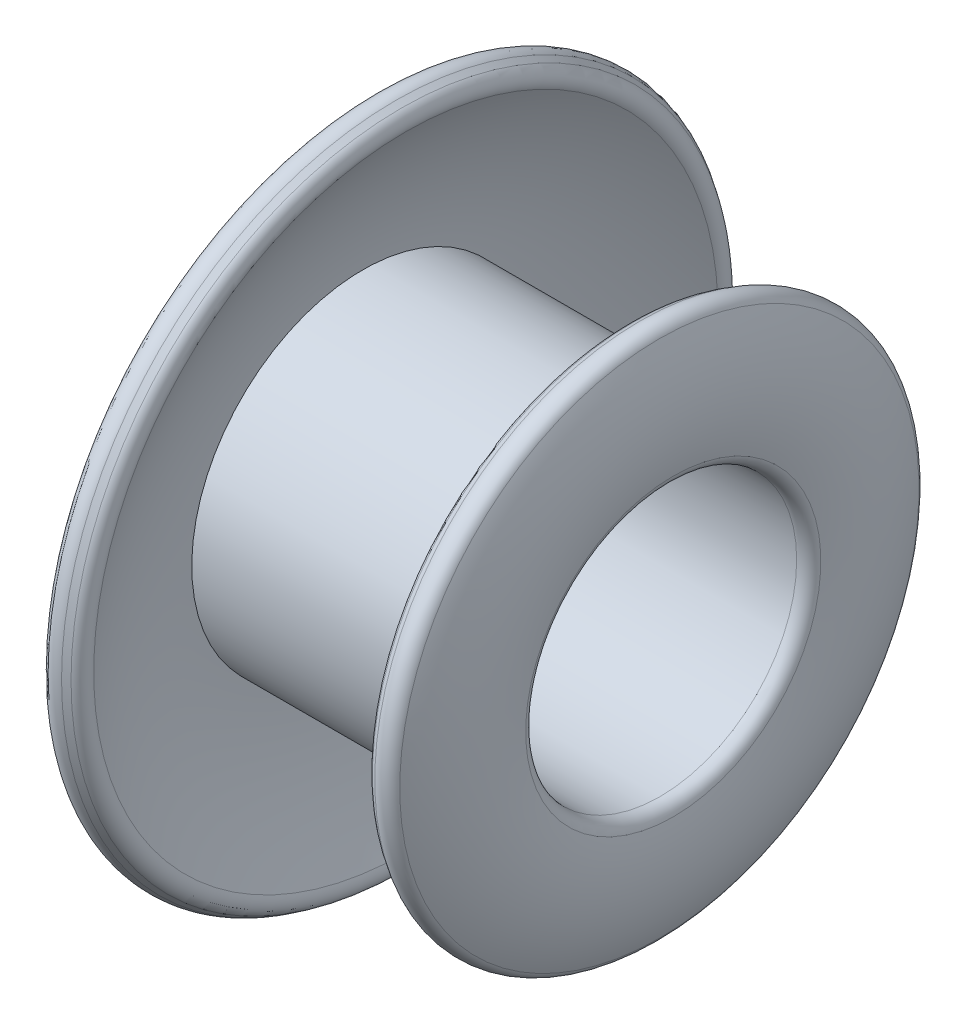
ISO-10303-21;
HEADER;
FILE_DESCRIPTION(('STEP AP214'),'2;1');
FILE_NAME('part.step','',(''),(''),'','','');
FILE_SCHEMA(('AUTOMOTIVE_DESIGN { 1 0 10303 214 1 1 1 1 }'));
ENDSEC;
DATA;
#1=APPLICATION_CONTEXT('core data for automotive mechanical design processes');
#2=APPLICATION_PROTOCOL_DEFINITION('international standard','automotive_design',2000,#1);
#3=PRODUCT_CONTEXT('',#1,'mechanical');
#4=PRODUCT('Part','Part','',(#3));
#5=PRODUCT_RELATED_PRODUCT_CATEGORY('part','',(#4));
#6=PRODUCT_DEFINITION_FORMATION('','',#4);
#7=PRODUCT_DEFINITION_CONTEXT('part definition',#1,'design');
#8=PRODUCT_DEFINITION('design','',#6,#7);
#9=PRODUCT_DEFINITION_SHAPE('','',#8);
#10=(LENGTH_UNIT() NAMED_UNIT(*) SI_UNIT(.MILLI.,.METRE.));
#11=(NAMED_UNIT(*) PLANE_ANGLE_UNIT() SI_UNIT($,.RADIAN.));
#12=(NAMED_UNIT(*) SI_UNIT($,.STERADIAN.) SOLID_ANGLE_UNIT());
#13=UNCERTAINTY_MEASURE_WITH_UNIT(LENGTH_MEASURE(1.E-05),#10,'distance_accuracy_value','');
#14=(GEOMETRIC_REPRESENTATION_CONTEXT(3) GLOBAL_UNCERTAINTY_ASSIGNED_CONTEXT((#13)) GLOBAL_UNIT_ASSIGNED_CONTEXT((#10,
#11,#12)) REPRESENTATION_CONTEXT('',''));
#15=CARTESIAN_POINT('',(0.,0.,0.));
#16=DIRECTION('',(0.,0.,1.));
#17=DIRECTION('',(1.,0.,0.));
#18=AXIS2_PLACEMENT_3D('',#15,#16,#17);
#19=CARTESIAN_POINT('',(0.141131844972978,0.,0.));
#20=DIRECTION('',(-1.,0.,0.));
#21=DIRECTION('',(0.,-1.,0.));
#22=AXIS2_PLACEMENT_3D('',#19,#20,#21);
#23=TOROIDAL_SURFACE('',#22,1.34305829547591,1.);
#24=CARTESIAN_POINT('',(1.03898754191996,0.,0.));
#25=DIRECTION('',(-1.,0.,0.));
#26=DIRECTION('',(0.,-1.,0.));
#27=AXIS2_PLACEMENT_3D('',#24,#25,#26);
#28=CIRCLE('',#27,1.78334814030525);
#29=CARTESIAN_POINT('',(1.03898754191996,-1.78334814030525,0.));
#30=VERTEX_POINT('',#29);
#31=EDGE_CURVE('E10',#30,#30,#28,.T.);
#32=ORIENTED_EDGE('',*,*,#31,.T.);
#33=EDGE_LOOP('',(#32));
#34=FACE_BOUND('',#33,.T.);
#35=CARTESIAN_POINT('',(1.13679250686694,0.,0.));
#36=DIRECTION('',(-1.,0.,0.));
#37=DIRECTION('',(0.,-1.,0.));
#38=AXIS2_PLACEMENT_3D('',#35,#36,#37);
#39=CIRCLE('',#38,1.25);
#40=CARTESIAN_POINT('',(1.13679250686694,-1.25,0.));
#41=VERTEX_POINT('',#40);
#42=EDGE_CURVE('E75',#41,#41,#39,.T.);
#43=ORIENTED_EDGE('',*,*,#42,.F.);
#44=EDGE_LOOP('',(#43));
#45=FACE_BOUND('',#44,.T.);
#46=ADVANCED_FACE('F31',(#34,#45),#23,.F.);
#47=CARTESIAN_POINT('',(-0.642156862745098,0.,0.));
#48=DIRECTION('',(-1.,0.,0.));
#49=DIRECTION('',(0.,-1.,0.));
#50=AXIS2_PLACEMENT_3D('',#47,#48,#49);
#51=CYLINDRICAL_SURFACE('',#50,1.25);
#52=ORIENTED_EDGE('',*,*,#42,.T.);
#53=EDGE_LOOP('',(#52));
#54=FACE_BOUND('',#53,.T.);
#55=CARTESIAN_POINT('',(-0.906865240760521,0.,0.));
#56=DIRECTION('',(-1.,0.,0.));
#57=DIRECTION('',(0.,-1.,0.));
#58=AXIS2_PLACEMENT_3D('',#55,#56,#57);
#59=CIRCLE('',#58,1.25);
#60=CARTESIAN_POINT('',(-0.90686524076052,-1.25,0.));
#61=VERTEX_POINT('',#60);
#62=EDGE_CURVE('E78',#61,#61,#59,.T.);
#63=ORIENTED_EDGE('',*,*,#62,.F.);
#64=EDGE_LOOP('',(#63));
#65=FACE_BOUND('',#64,.T.);
#66=ADVANCED_FACE('F84',(#54,#65),#51,.T.);
#67=CARTESIAN_POINT('',(1.33984071683301,0.,0.));
#68=DIRECTION('',(-1.,0.,0.));
#69=DIRECTION('',(0.,-1.,0.));
#70=AXIS2_PLACEMENT_3D('',#67,#68,#69);
#71=DEGENERATE_TOROIDAL_SURFACE('',#70,1.12829404240647,2.25,.T.);
#72=CARTESIAN_POINT('',(-0.592058328941816,0.,0.));
#73=DIRECTION('',(1.,0.,0.));
#74=DIRECTION('',(0.,1.,0.));
#75=AXIS2_PLACEMENT_3D('',#72,#73,#74);
#76=CIRCLE('',#75,2.28166565508572);
#77=CARTESIAN_POINT('',(-0.592058328941817,2.28166565508572,0.));
#78=VERTEX_POINT('',#77);
#79=EDGE_CURVE('E66',#78,#78,#76,.T.);
#80=ORIENTED_EDGE('',*,*,#79,.T.);
#81=EDGE_LOOP('',(#80));
#82=FACE_BOUND('',#81,.T.);
#83=ORIENTED_EDGE('',*,*,#62,.T.);
#84=EDGE_LOOP('',(#83));
#85=FACE_BOUND('',#84,.T.);
#86=ADVANCED_FACE('F82',(#82,#85),#71,.F.);
#87=CARTESIAN_POINT('',(-0.541228776934027,0.,0.));
#88=DIRECTION('',(-1.,0.,0.));
#89=DIRECTION('',(0.,-1.,0.));
#90=AXIS2_PLACEMENT_3D('',#87,#88,#89);
#91=CONICAL_SURFACE('',#90,2.36282940424065,0.580787382668253);
#92=CARTESIAN_POINT('',(-0.623052270450289,0.,0.));
#93=DIRECTION('',(1.,0.,0.));
#94=DIRECTION('',(0.,1.,0.));
#95=AXIS2_PLACEMENT_3D('',#92,#93,#94);
#96=CIRCLE('',#95,2.41652970426111);
#97=CARTESIAN_POINT('',(-0.623052270450289,2.41652970426111,0.));
#98=VERTEX_POINT('',#97);
#99=EDGE_CURVE('E69',#98,#98,#96,.F.);
#100=ORIENTED_EDGE('',*,*,#99,.T.);
#101=EDGE_LOOP('',(#100));
#102=FACE_BOUND('',#101,.T.);
#103=CARTESIAN_POINT('',(-0.664890922222513,0.,0.));
#104=DIRECTION('',(-1.,0.,0.));
#105=DIRECTION('',(0.,-1.,0.));
#106=AXIS2_PLACEMENT_3D('',#103,#104,#105);
#107=CIRCLE('',#106,2.44398817683505);
#108=CARTESIAN_POINT('',(-0.664890922222513,-2.44398817683505,0.));
#109=VERTEX_POINT('',#108);
#110=EDGE_CURVE('E72',#109,#109,#107,.F.);
#111=ORIENTED_EDGE('',*,*,#110,.T.);
#112=EDGE_LOOP('',(#111));
#113=FACE_BOUND('',#112,.T.);
#114=ADVANCED_FACE('F93',(#102,#113),#91,.T.);
#115=CARTESIAN_POINT('',(1.33984071683301,0.,0.));
#116=DIRECTION('',(-1.,0.,0.));
#117=DIRECTION('',(0.,-1.,0.));
#118=AXIS2_PLACEMENT_3D('',#115,#116,#117);
#119=DEGENERATE_TOROIDAL_SURFACE('',#118,1.12829404240647,2.5,.T.);
#120=CARTESIAN_POINT('',(-1.15998554604659,0.,0.));
#121=DIRECTION('',(1.,0.,0.));
#122=DIRECTION('',(0.,1.,0.));
#123=AXIS2_PLACEMENT_3D('',#120,#121,#122);
#124=CIRCLE('',#123,1.09882108156639);
#125=CARTESIAN_POINT('',(-1.15998554604659,1.09882108156639,0.));
#126=VERTEX_POINT('',#125);
#127=EDGE_CURVE('E54',#126,#126,#124,.T.);
#128=ORIENTED_EDGE('',*,*,#127,.T.);
#129=EDGE_LOOP('',(#128));
#130=FACE_BOUND('',#129,.T.);
#131=CARTESIAN_POINT('',(-0.80557582208289,0.,0.));
#132=DIRECTION('',(1.,0.,0.));
#133=DIRECTION('',(0.,1.,0.));
#134=AXIS2_PLACEMENT_3D('',#131,#132,#133);
#135=CIRCLE('',#134,2.41172221513222);
#136=CARTESIAN_POINT('',(-0.80557582208289,2.41172221513222,0.));
#137=VERTEX_POINT('',#136);
#138=EDGE_CURVE('E57',#137,#137,#135,.F.);
#139=ORIENTED_EDGE('',*,*,#138,.T.);
#140=EDGE_LOOP('',(#139));
#141=FACE_BOUND('',#140,.T.);
#142=ADVANCED_FACE('F136',(#130,#141),#119,.T.);
#143=CARTESIAN_POINT('',(-0.642156862745098,0.,0.));
#144=DIRECTION('',(-1.,0.,0.));
#145=DIRECTION('',(0.,-1.,0.));
#146=AXIS2_PLACEMENT_3D('',#143,#144,#145);
#147=CYLINDRICAL_SURFACE('',#146,1.);
#148=CARTESIAN_POINT('',(-1.05999249553078,0.,0.));
#149=DIRECTION('',(1.,0.,0.));
#150=DIRECTION('',(0.,1.,0.));
#151=AXIS2_PLACEMENT_3D('',#148,#149,#150);
#152=CIRCLE('',#151,1.);
#153=CARTESIAN_POINT('',(-1.05999249553078,1.,0.));
#154=VERTEX_POINT('',#153);
#155=EDGE_CURVE('E60',#154,#154,#152,.F.);
#156=ORIENTED_EDGE('',*,*,#155,.T.);
#157=EDGE_LOOP('',(#156));
#158=FACE_BOUND('',#157,.T.);
#159=CARTESIAN_POINT('',(1.2651526032334,0.,0.));
#160=DIRECTION('',(1.,0.,0.));
#161=DIRECTION('',(0.,1.,0.));
#162=AXIS2_PLACEMENT_3D('',#159,#160,#161);
#163=CIRCLE('',#162,1.);
#164=CARTESIAN_POINT('',(1.2651526032334,1.,0.));
#165=VERTEX_POINT('',#164);
#166=EDGE_CURVE('E63',#165,#165,#163,.T.);
#167=ORIENTED_EDGE('',*,*,#166,.T.);
#168=EDGE_LOOP('',(#167));
#169=FACE_BOUND('',#168,.T.);
#170=ADVANCED_FACE('F128',(#158,#169),#147,.F.);
#171=CARTESIAN_POINT('',(0.141131844972978,0.,0.));
#172=DIRECTION('',(-1.,0.,0.));
#173=DIRECTION('',(0.,-1.,0.));
#174=AXIS2_PLACEMENT_3D('',#171,#172,#173);
#175=TOROIDAL_SURFACE('',#174,1.34305829547591,1.25);
#176=CARTESIAN_POINT('',(1.36289353873431,0.,0.));
#177=DIRECTION('',(-1.,0.,0.));
#178=DIRECTION('',(0.,-1.,0.));
#179=AXIS2_PLACEMENT_3D('',#176,#177,#178);
#180=CIRCLE('',#179,1.07886449604557);
#181=CARTESIAN_POINT('',(1.36289353873431,-1.07886449604557,0.));
#182=VERTEX_POINT('',#181);
#183=EDGE_CURVE('E46',#182,#182,#180,.T.);
#184=ORIENTED_EDGE('',*,*,#183,.T.);
#185=EDGE_LOOP('',(#184));
#186=FACE_BOUND('',#185,.T.);
#187=CARTESIAN_POINT('',(1.2612586347418,0.,0.));
#188=DIRECTION('',(-1.,0.,0.));
#189=DIRECTION('',(0.,-1.,0.));
#190=AXIS2_PLACEMENT_3D('',#187,#188,#189);
#191=CIRCLE('',#190,1.89786995256523);
#192=CARTESIAN_POINT('',(1.2612586347418,-1.89786995256523,0.));
#193=VERTEX_POINT('',#192);
#194=EDGE_CURVE('E51',#193,#193,#191,.F.);
#195=ORIENTED_EDGE('',*,*,#194,.T.);
#196=EDGE_LOOP('',(#195));
#197=FACE_BOUND('',#196,.T.);
#198=ADVANCED_FACE('F126',(#186,#197),#175,.T.);
#199=CARTESIAN_POINT('',(0.995243347447374,0.,0.));
#200=DIRECTION('',(1.,0.,0.));
#201=DIRECTION('',(0.,1.,0.));
#202=AXIS2_PLACEMENT_3D('',#199,#200,#201);
#203=CONICAL_SURFACE('',#202,1.8631482312956,0.546956244836715);
#204=CARTESIAN_POINT('',(1.11963949797832,0.,0.));
#205=DIRECTION('',(1.,0.,0.));
#206=DIRECTION('',(0.,1.,0.));
#207=AXIS2_PLACEMENT_3D('',#204,#205,#206);
#208=CIRCLE('',#207,1.93889617024552);
#209=CARTESIAN_POINT('',(1.11963949797832,1.93889617024552,0.));
#210=VERTEX_POINT('',#209);
#211=EDGE_CURVE('E38',#210,#210,#208,.F.);
#212=ORIENTED_EDGE('',*,*,#211,.T.);
#213=EDGE_LOOP('',(#212));
#214=FACE_BOUND('',#213,.T.);
#215=CARTESIAN_POINT('',(1.07676411803269,0.,0.));
#216=DIRECTION('',(-1.,0.,0.));
#217=DIRECTION('',(0.,-1.,0.));
#218=AXIS2_PLACEMENT_3D('',#215,#216,#217);
#219=CIRCLE('',#218,1.91278827503562);
#220=CARTESIAN_POINT('',(1.07676411803269,-1.91278827503562,0.));
#221=VERTEX_POINT('',#220);
#222=EDGE_CURVE('E42',#221,#221,#219,.F.);
#223=ORIENTED_EDGE('',*,*,#222,.T.);
#224=EDGE_LOOP('',(#223));
#225=FACE_BOUND('',#224,.T.);
#226=ADVANCED_FACE('F104',(#214,#225),#203,.T.);
#227=CARTESIAN_POINT('',(-0.67792050875403,0.,0.));
#228=DIRECTION('',(1.,0.,0.));
#229=DIRECTION('',(0.,1.,0.));
#230=AXIS2_PLACEMENT_3D('',#227,#228,#229);
#231=TOROIDAL_SURFACE('',#230,2.33292661564924,0.1);
#232=ORIENTED_EDGE('',*,*,#79,.F.);
#233=EDGE_LOOP('',(#232));
#234=FACE_BOUND('',#233,.T.);
#235=ORIENTED_EDGE('',*,*,#99,.F.);
#236=EDGE_LOOP('',(#235));
#237=FACE_BOUND('',#236,.T.);
#238=ADVANCED_FACE('F100',(#234,#237),#231,.T.);
#239=CARTESIAN_POINT('',(-1.05999249553078,0.,0.));
#240=DIRECTION('',(1.,0.,0.));
#241=DIRECTION('',(0.,1.,0.));
#242=AXIS2_PLACEMENT_3D('',#239,#240,#241);
#243=TOROIDAL_SURFACE('',#242,1.1,0.1);
#244=ORIENTED_EDGE('',*,*,#127,.F.);
#245=EDGE_LOOP('',(#244));
#246=FACE_BOUND('',#245,.T.);
#247=ORIENTED_EDGE('',*,*,#155,.F.);
#248=EDGE_LOOP('',(#247));
#249=FACE_BOUND('',#248,.T.);
#250=ADVANCED_FACE('F103',(#246,#249),#243,.T.);
#251=CARTESIAN_POINT('',(-0.719759160526254,0.,0.));
#252=DIRECTION('',(1.,0.,0.));
#253=DIRECTION('',(0.,1.,0.));
#254=AXIS2_PLACEMENT_3D('',#251,#252,#253);
#255=TOROIDAL_SURFACE('',#254,2.36038508822319,0.1);
#256=ORIENTED_EDGE('',*,*,#110,.F.);
#257=EDGE_LOOP('',(#256));
#258=FACE_BOUND('',#257,.T.);
#259=ORIENTED_EDGE('',*,*,#138,.F.);
#260=EDGE_LOOP('',(#259));
#261=FACE_BOUND('',#260,.T.);
#262=ADVANCED_FACE('F108',(#258,#261),#255,.T.);
#263=CARTESIAN_POINT('',(1.2651526032334,0.,0.));
#264=DIRECTION('',(1.,0.,0.));
#265=DIRECTION('',(0.,1.,0.));
#266=AXIS2_PLACEMENT_3D('',#263,#264,#265);
#267=TOROIDAL_SURFACE('',#266,1.1,0.1);
#268=ORIENTED_EDGE('',*,*,#166,.F.);
#269=EDGE_LOOP('',(#268));
#270=FACE_BOUND('',#269,.T.);
#271=ORIENTED_EDGE('',*,*,#183,.F.);
#272=EDGE_LOOP('',(#271));
#273=FACE_BOUND('',#272,.T.);
#274=ADVANCED_FACE('F112',(#270,#273),#267,.T.);
#275=CARTESIAN_POINT('',(1.17164849156029,0.,0.));
#276=DIRECTION('',(1.,0.,0.));
#277=DIRECTION('',(0.,1.,0.));
#278=AXIS2_PLACEMENT_3D('',#275,#276,#277);
#279=TOROIDAL_SURFACE('',#278,1.85348501999808,0.1);
#280=ORIENTED_EDGE('',*,*,#194,.F.);
#281=EDGE_LOOP('',(#280));
#282=FACE_BOUND('',#281,.T.);
#283=ORIENTED_EDGE('',*,*,#211,.F.);
#284=EDGE_LOOP('',(#283));
#285=FACE_BOUND('',#284,.T.);
#286=ADVANCED_FACE('F115',(#282,#285),#279,.T.);
#287=CARTESIAN_POINT('',(1.12877311161466,0.,0.));
#288=DIRECTION('',(1.,0.,0.));
#289=DIRECTION('',(0.,1.,0.));
#290=AXIS2_PLACEMENT_3D('',#287,#288,#289);
#291=TOROIDAL_SURFACE('',#290,1.82737712478818,0.1);
#292=ORIENTED_EDGE('',*,*,#222,.F.);
#293=EDGE_LOOP('',(#292));
#294=FACE_BOUND('',#293,.T.);
#295=ORIENTED_EDGE('',*,*,#31,.F.);
#296=EDGE_LOOP('',(#295));
#297=FACE_BOUND('',#296,.T.);
#298=ADVANCED_FACE('F33',(#294,#297),#291,.T.);
#299=CLOSED_SHELL('',(#46,#66,#86,#114,#142,#170,#198,#226,#238,#250,#262,#274,#286,#298));
#300=MANIFOLD_SOLID_BREP('B2',#299);
#301=ADVANCED_BREP_SHAPE_REPRESENTATION('',(#18,#300),#14);
#302=SHAPE_DEFINITION_REPRESENTATION(#9,#301);
ENDSEC;
END-ISO-10303-21;
